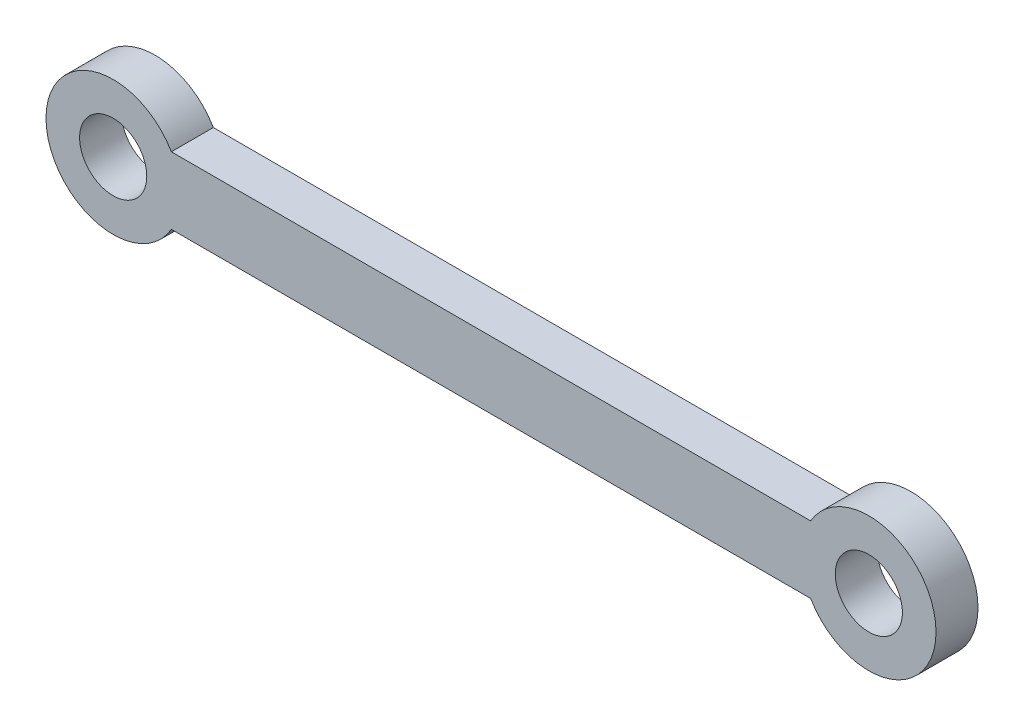
ISO-10303-21;
HEADER;
FILE_DESCRIPTION(('STEP AP214'),'2;1');
FILE_NAME('part.step','',(''),(''),'','','');
FILE_SCHEMA(('AUTOMOTIVE_DESIGN { 1 0 10303 214 1 1 1 1 }'));
ENDSEC;
DATA;
#1=APPLICATION_CONTEXT('core data for automotive mechanical design processes');
#2=APPLICATION_PROTOCOL_DEFINITION('international standard','automotive_design',2000,#1);
#3=PRODUCT_CONTEXT('',#1,'mechanical');
#4=PRODUCT('Part','Part','',(#3));
#5=PRODUCT_RELATED_PRODUCT_CATEGORY('part','',(#4));
#6=PRODUCT_DEFINITION_FORMATION('','',#4);
#7=PRODUCT_DEFINITION_CONTEXT('part definition',#1,'design');
#8=PRODUCT_DEFINITION('design','',#6,#7);
#9=PRODUCT_DEFINITION_SHAPE('','',#8);
#10=(LENGTH_UNIT() NAMED_UNIT(*) SI_UNIT(.MILLI.,.METRE.));
#11=(NAMED_UNIT(*) PLANE_ANGLE_UNIT() SI_UNIT($,.RADIAN.));
#12=(NAMED_UNIT(*) SI_UNIT($,.STERADIAN.) SOLID_ANGLE_UNIT());
#13=UNCERTAINTY_MEASURE_WITH_UNIT(LENGTH_MEASURE(1.E-05),#10,'distance_accuracy_value','');
#14=(GEOMETRIC_REPRESENTATION_CONTEXT(3) GLOBAL_UNCERTAINTY_ASSIGNED_CONTEXT((#13)) GLOBAL_UNIT_ASSIGNED_CONTEXT((#10,
#11,#12)) REPRESENTATION_CONTEXT('',''));
#15=CARTESIAN_POINT('',(0.,0.,0.));
#16=DIRECTION('',(0.,0.,1.));
#17=DIRECTION('',(1.,0.,0.));
#18=AXIS2_PLACEMENT_3D('',#15,#16,#17);
#19=CARTESIAN_POINT('',(0.,2.54,3.175));
#20=DIRECTION('',(0.,0.,-1.));
#21=DIRECTION('',(-1.,0.,0.));
#22=AXIS2_PLACEMENT_3D('',#19,#20,#21);
#23=CYLINDRICAL_SURFACE('',#22,5.08);
#24=CARTESIAN_POINT('',(0.,2.54,0.));
#25=DIRECTION('',(0.,0.,1.));
#26=DIRECTION('',(1.,0.,0.));
#27=AXIS2_PLACEMENT_3D('',#24,#25,#26);
#28=CIRCLE('',#27,5.08);
#29=CARTESIAN_POINT('',(4.39940905122495,5.08,0.));
#30=VERTEX_POINT('',#29);
#31=CARTESIAN_POINT('',(4.39940905122495,0.,0.));
#32=VERTEX_POINT('',#31);
#33=EDGE_CURVE('E107',#30,#32,#28,.T.);
#34=ORIENTED_EDGE('',*,*,#33,.T.);
#35=DIRECTION('',(0.,0.,-1.));
#36=VECTOR('',#35,1.);
#37=CARTESIAN_POINT('',(4.39940905122495,0.,3.175));
#38=LINE('',#37,#36);
#39=CARTESIAN_POINT('',(4.39940905122495,0.,3.175));
#40=VERTEX_POINT('',#39);
#41=EDGE_CURVE('E11',#40,#32,#38,.T.);
#42=ORIENTED_EDGE('',*,*,#41,.F.);
#43=CARTESIAN_POINT('',(0.,2.54,3.175));
#44=DIRECTION('',(0.,0.,1.));
#45=DIRECTION('',(1.,0.,0.));
#46=AXIS2_PLACEMENT_3D('',#43,#44,#45);
#47=CIRCLE('',#46,5.08);
#48=CARTESIAN_POINT('',(4.39940905122495,5.08,3.175));
#49=VERTEX_POINT('',#48);
#50=EDGE_CURVE('E89',#49,#40,#47,.T.);
#51=ORIENTED_EDGE('',*,*,#50,.F.);
#52=DIRECTION('',(0.,0.,-1.));
#53=VECTOR('',#52,1.);
#54=CARTESIAN_POINT('',(4.39940905122495,5.08,3.175));
#55=LINE('',#54,#53);
#56=EDGE_CURVE('E56',#49,#30,#55,.T.);
#57=ORIENTED_EDGE('',*,*,#56,.T.);
#58=EDGE_LOOP('',(#34,#42,#51,#57));
#59=FACE_BOUND('',#58,.T.);
#60=ADVANCED_FACE('F39',(#59),#23,.T.);
#61=CARTESIAN_POINT('',(0.,0.,3.175));
#62=DIRECTION('',(0.,1.,0.));
#63=DIRECTION('',(0.,0.,1.));
#64=AXIS2_PLACEMENT_3D('',#61,#62,#63);
#65=PLANE('',#64);
#66=DIRECTION('',(1.,0.,0.));
#67=VECTOR('',#66,1.);
#68=CARTESIAN_POINT('',(0.,0.,0.));
#69=LINE('',#68,#67);
#70=CARTESIAN_POINT('',(52.750590948775,0.,0.));
#71=VERTEX_POINT('',#70);
#72=EDGE_CURVE('E95',#32,#71,#69,.T.);
#73=ORIENTED_EDGE('',*,*,#72,.T.);
#74=DIRECTION('',(0.,0.,-1.));
#75=VECTOR('',#74,1.);
#76=CARTESIAN_POINT('',(52.750590948775,0.,3.175));
#77=LINE('',#76,#75);
#78=CARTESIAN_POINT('',(52.750590948775,0.,3.175));
#79=VERTEX_POINT('',#78);
#80=EDGE_CURVE('E48',#79,#71,#77,.T.);
#81=ORIENTED_EDGE('',*,*,#80,.F.);
#82=DIRECTION('',(1.,0.,0.));
#83=VECTOR('',#82,1.);
#84=CARTESIAN_POINT('',(0.,0.,3.175));
#85=LINE('',#84,#83);
#86=EDGE_CURVE('E82',#40,#79,#85,.T.);
#87=ORIENTED_EDGE('',*,*,#86,.F.);
#88=ORIENTED_EDGE('',*,*,#41,.T.);
#89=EDGE_LOOP('',(#73,#81,#87,#88));
#90=FACE_BOUND('',#89,.T.);
#91=ADVANCED_FACE('F94',(#90),#65,.F.);
#92=CARTESIAN_POINT('',(57.15,2.54,3.175));
#93=DIRECTION('',(0.,0.,-1.));
#94=DIRECTION('',(-1.,0.,0.));
#95=AXIS2_PLACEMENT_3D('',#92,#93,#94);
#96=CYLINDRICAL_SURFACE('',#95,5.08);
#97=CARTESIAN_POINT('',(57.15,2.54,0.));
#98=DIRECTION('',(0.,0.,1.));
#99=DIRECTION('',(1.,0.,0.));
#100=AXIS2_PLACEMENT_3D('',#97,#98,#99);
#101=CIRCLE('',#100,5.08);
#102=CARTESIAN_POINT('',(52.750590948775,5.08,0.));
#103=VERTEX_POINT('',#102);
#104=EDGE_CURVE('E113',#71,#103,#101,.T.);
#105=ORIENTED_EDGE('',*,*,#104,.T.);
#106=DIRECTION('',(0.,0.,-1.));
#107=VECTOR('',#106,1.);
#108=CARTESIAN_POINT('',(52.750590948775,5.08,3.175));
#109=LINE('',#108,#107);
#110=CARTESIAN_POINT('',(52.750590948775,5.08,3.175));
#111=VERTEX_POINT('',#110);
#112=EDGE_CURVE('E71',#111,#103,#109,.T.);
#113=ORIENTED_EDGE('',*,*,#112,.F.);
#114=CARTESIAN_POINT('',(57.15,2.54,3.175));
#115=DIRECTION('',(0.,0.,1.));
#116=DIRECTION('',(1.,0.,0.));
#117=AXIS2_PLACEMENT_3D('',#114,#115,#116);
#118=CIRCLE('',#117,5.08);
#119=EDGE_CURVE('E88',#79,#111,#118,.T.);
#120=ORIENTED_EDGE('',*,*,#119,.F.);
#121=ORIENTED_EDGE('',*,*,#80,.T.);
#122=EDGE_LOOP('',(#105,#113,#120,#121));
#123=FACE_BOUND('',#122,.T.);
#124=ADVANCED_FACE('F99',(#123),#96,.T.);
#125=CARTESIAN_POINT('',(0.,5.08,3.175));
#126=DIRECTION('',(0.,1.,0.));
#127=DIRECTION('',(0.,0.,1.));
#128=AXIS2_PLACEMENT_3D('',#125,#126,#127);
#129=PLANE('',#128);
#130=DIRECTION('',(1.,0.,0.));
#131=VECTOR('',#130,1.);
#132=CARTESIAN_POINT('',(0.,5.08,0.));
#133=LINE('',#132,#131);
#134=EDGE_CURVE('E116',#30,#103,#133,.T.);
#135=ORIENTED_EDGE('',*,*,#134,.F.);
#136=ORIENTED_EDGE('',*,*,#56,.F.);
#137=DIRECTION('',(1.,0.,0.));
#138=VECTOR('',#137,1.);
#139=CARTESIAN_POINT('',(0.,5.08,3.175));
#140=LINE('',#139,#138);
#141=EDGE_CURVE('E101',#49,#111,#140,.T.);
#142=ORIENTED_EDGE('',*,*,#141,.T.);
#143=ORIENTED_EDGE('',*,*,#112,.T.);
#144=EDGE_LOOP('',(#135,#136,#142,#143));
#145=FACE_BOUND('',#144,.T.);
#146=ADVANCED_FACE('F154',(#145),#129,.T.);
#147=CARTESIAN_POINT('',(0.,0.,3.175));
#148=DIRECTION('',(0.,0.,1.));
#149=DIRECTION('',(1.,0.,0.));
#150=AXIS2_PLACEMENT_3D('',#147,#148,#149);
#151=PLANE('',#150);
#152=CARTESIAN_POINT('',(0.,2.54,3.175));
#153=DIRECTION('',(0.,0.,1.));
#154=DIRECTION('',(1.,0.,0.));
#155=AXIS2_PLACEMENT_3D('',#152,#153,#154);
#156=CIRCLE('',#155,2.54);
#157=CARTESIAN_POINT('',(2.54000000000002,2.54,3.175));
#158=VERTEX_POINT('',#157);
#159=EDGE_CURVE('E134',#158,#158,#156,.T.);
#160=ORIENTED_EDGE('',*,*,#159,.F.);
#161=EDGE_LOOP('',(#160));
#162=FACE_BOUND('',#161,.T.);
#163=CARTESIAN_POINT('',(57.15,2.54,3.175));
#164=DIRECTION('',(0.,0.,1.));
#165=DIRECTION('',(1.,0.,0.));
#166=AXIS2_PLACEMENT_3D('',#163,#164,#165);
#167=CIRCLE('',#166,2.54);
#168=CARTESIAN_POINT('',(59.69,2.54,3.175));
#169=VERTEX_POINT('',#168);
#170=EDGE_CURVE('E126',#169,#169,#167,.T.);
#171=ORIENTED_EDGE('',*,*,#170,.F.);
#172=EDGE_LOOP('',(#171));
#173=FACE_BOUND('',#172,.T.);
#174=ORIENTED_EDGE('',*,*,#50,.T.);
#175=ORIENTED_EDGE('',*,*,#86,.T.);
#176=ORIENTED_EDGE('',*,*,#119,.T.);
#177=ORIENTED_EDGE('',*,*,#141,.F.);
#178=EDGE_LOOP('',(#174,#175,#176,#177));
#179=FACE_BOUND('',#178,.T.);
#180=ADVANCED_FACE('F85',(#162,#173,#179),#151,.T.);
#181=CARTESIAN_POINT('',(0.,0.,0.));
#182=DIRECTION('',(0.,0.,1.));
#183=DIRECTION('',(1.,0.,0.));
#184=AXIS2_PLACEMENT_3D('',#181,#182,#183);
#185=PLANE('',#184);
#186=CARTESIAN_POINT('',(0.,2.54,0.));
#187=DIRECTION('',(0.,0.,1.));
#188=DIRECTION('',(1.,0.,0.));
#189=AXIS2_PLACEMENT_3D('',#186,#187,#188);
#190=CIRCLE('',#189,2.54);
#191=CARTESIAN_POINT('',(2.54000000000002,2.54,0.));
#192=VERTEX_POINT('',#191);
#193=EDGE_CURVE('E110',#192,#192,#190,.T.);
#194=ORIENTED_EDGE('',*,*,#193,.T.);
#195=EDGE_LOOP('',(#194));
#196=FACE_BOUND('',#195,.T.);
#197=CARTESIAN_POINT('',(57.15,2.54,0.));
#198=DIRECTION('',(0.,0.,1.));
#199=DIRECTION('',(1.,0.,0.));
#200=AXIS2_PLACEMENT_3D('',#197,#198,#199);
#201=CIRCLE('',#200,2.54);
#202=CARTESIAN_POINT('',(59.69,2.54,0.));
#203=VERTEX_POINT('',#202);
#204=EDGE_CURVE('E130',#203,#203,#201,.T.);
#205=ORIENTED_EDGE('',*,*,#204,.T.);
#206=EDGE_LOOP('',(#205));
#207=FACE_BOUND('',#206,.T.);
#208=ORIENTED_EDGE('',*,*,#33,.F.);
#209=ORIENTED_EDGE('',*,*,#134,.T.);
#210=ORIENTED_EDGE('',*,*,#104,.F.);
#211=ORIENTED_EDGE('',*,*,#72,.F.);
#212=EDGE_LOOP('',(#208,#209,#210,#211));
#213=FACE_BOUND('',#212,.T.);
#214=ADVANCED_FACE('F142',(#196,#207,#213),#185,.F.);
#215=CARTESIAN_POINT('',(57.15,2.54,0.));
#216=DIRECTION('',(0.,0.,1.));
#217=DIRECTION('',(1.,0.,0.));
#218=AXIS2_PLACEMENT_3D('',#215,#216,#217);
#219=CYLINDRICAL_SURFACE('',#218,2.54);
#220=ORIENTED_EDGE('',*,*,#204,.F.);
#221=EDGE_LOOP('',(#220));
#222=FACE_BOUND('',#221,.T.);
#223=ORIENTED_EDGE('',*,*,#170,.T.);
#224=EDGE_LOOP('',(#223));
#225=FACE_BOUND('',#224,.T.);
#226=ADVANCED_FACE('F148',(#222,#225),#219,.F.);
#227=CARTESIAN_POINT('',(0.,2.54,0.));
#228=DIRECTION('',(0.,0.,1.));
#229=DIRECTION('',(1.,0.,0.));
#230=AXIS2_PLACEMENT_3D('',#227,#228,#229);
#231=CYLINDRICAL_SURFACE('',#230,2.54);
#232=ORIENTED_EDGE('',*,*,#193,.F.);
#233=EDGE_LOOP('',(#232));
#234=FACE_BOUND('',#233,.T.);
#235=ORIENTED_EDGE('',*,*,#159,.T.);
#236=EDGE_LOOP('',(#235));
#237=FACE_BOUND('',#236,.T.);
#238=ADVANCED_FACE('F145',(#234,#237),#231,.F.);
#239=CLOSED_SHELL('',(#60,#91,#124,#146,#180,#214,#226,#238));
#240=MANIFOLD_SOLID_BREP('B2',#239);
#241=ADVANCED_BREP_SHAPE_REPRESENTATION('',(#18,#240),#14);
#242=SHAPE_DEFINITION_REPRESENTATION(#9,#241);
ENDSEC;
END-ISO-10303-21;
